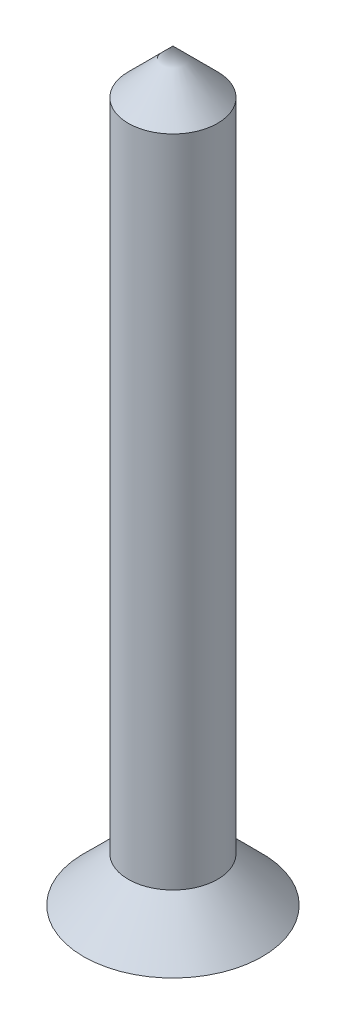
ISO-10303-21;
HEADER;
FILE_DESCRIPTION(('STEP AP214'),'2;1');
FILE_NAME('part.step','',(''),(''),'','','');
FILE_SCHEMA(('AUTOMOTIVE_DESIGN { 1 0 10303 214 1 1 1 1 }'));
ENDSEC;
DATA;
#1=APPLICATION_CONTEXT('core data for automotive mechanical design processes');
#2=APPLICATION_PROTOCOL_DEFINITION('international standard','automotive_design',2000,#1);
#3=PRODUCT_CONTEXT('',#1,'mechanical');
#4=PRODUCT('Part','Part','',(#3));
#5=PRODUCT_RELATED_PRODUCT_CATEGORY('part','',(#4));
#6=PRODUCT_DEFINITION_FORMATION('','',#4);
#7=PRODUCT_DEFINITION_CONTEXT('part definition',#1,'design');
#8=PRODUCT_DEFINITION('design','',#6,#7);
#9=PRODUCT_DEFINITION_SHAPE('','',#8);
#10=(LENGTH_UNIT() NAMED_UNIT(*) SI_UNIT(.MILLI.,.METRE.));
#11=(NAMED_UNIT(*) PLANE_ANGLE_UNIT() SI_UNIT($,.RADIAN.));
#12=(NAMED_UNIT(*) SI_UNIT($,.STERADIAN.) SOLID_ANGLE_UNIT());
#13=UNCERTAINTY_MEASURE_WITH_UNIT(LENGTH_MEASURE(1.E-05),#10,'distance_accuracy_value','');
#14=(GEOMETRIC_REPRESENTATION_CONTEXT(3) GLOBAL_UNCERTAINTY_ASSIGNED_CONTEXT((#13)) GLOBAL_UNIT_ASSIGNED_CONTEXT((#10,
#11,#12)) REPRESENTATION_CONTEXT('',''));
#15=CARTESIAN_POINT('',(0.,0.,0.));
#16=DIRECTION('',(0.,0.,1.));
#17=DIRECTION('',(1.,0.,0.));
#18=AXIS2_PLACEMENT_3D('',#15,#16,#17);
#19=CARTESIAN_POINT('',(0.,0.,0.));
#20=DIRECTION('',(0.,1.,0.));
#21=DIRECTION('',(0.,0.,1.));
#22=AXIS2_PLACEMENT_3D('',#19,#20,#21);
#23=PLANE('',#22);
#24=CARTESIAN_POINT('',(0.,0.,0.));
#25=DIRECTION('',(0.,1.,0.));
#26=DIRECTION('',(0.,0.,1.));
#27=AXIS2_PLACEMENT_3D('',#24,#25,#26);
#28=CIRCLE('',#27,6.);
#29=CARTESIAN_POINT('',(0.,0.,6.));
#30=VERTEX_POINT('',#29);
#31=EDGE_CURVE('E54',#30,#30,#28,.T.);
#32=ORIENTED_EDGE('',*,*,#31,.F.);
#33=EDGE_LOOP('',(#32));
#34=FACE_BOUND('',#33,.T.);
#35=ADVANCED_FACE('F46',(#34),#23,.F.);
#36=CARTESIAN_POINT('',(0.,50.,0.));
#37=DIRECTION('',(0.,-1.,0.));
#38=DIRECTION('',(0.,0.,-1.));
#39=AXIS2_PLACEMENT_3D('',#36,#37,#38);
#40=CYLINDRICAL_SURFACE('',#39,3.);
#41=CARTESIAN_POINT('',(0.,47.,0.));
#42=DIRECTION('',(0.,1.,0.));
#43=DIRECTION('',(0.,0.,1.));
#44=AXIS2_PLACEMENT_3D('',#41,#42,#43);
#45=CIRCLE('',#44,3.);
#46=CARTESIAN_POINT('',(0.,47.,3.));
#47=VERTEX_POINT('',#46);
#48=EDGE_CURVE('E11',#47,#47,#45,.F.);
#49=ORIENTED_EDGE('',*,*,#48,.T.);
#50=EDGE_LOOP('',(#49));
#51=FACE_BOUND('',#50,.T.);
#52=CARTESIAN_POINT('',(0.,3.,0.));
#53=DIRECTION('',(0.,1.,0.));
#54=DIRECTION('',(0.,0.,1.));
#55=AXIS2_PLACEMENT_3D('',#52,#53,#54);
#56=CIRCLE('',#55,3.);
#57=CARTESIAN_POINT('',(0.,3.,3.));
#58=VERTEX_POINT('',#57);
#59=EDGE_CURVE('E78',#58,#58,#56,.T.);
#60=ORIENTED_EDGE('',*,*,#59,.T.);
#61=EDGE_LOOP('',(#60));
#62=FACE_BOUND('',#61,.T.);
#63=ADVANCED_FACE('F58',(#51,#62),#40,.T.);
#64=CARTESIAN_POINT('',(0.,47.,0.));
#65=DIRECTION('',(0.,-1.,0.));
#66=DIRECTION('',(0.,0.,-1.));
#67=AXIS2_PLACEMENT_3D('',#64,#65,#66);
#68=CONICAL_SURFACE('',#67,3.00000000000001,0.785398163397447);
#69=ORIENTED_EDGE('',*,*,#48,.F.);
#70=EDGE_LOOP('',(#69));
#71=FACE_BOUND('',#70,.T.);
#72=CARTESIAN_POINT('',(0.,50.,0.));
#73=VERTEX_POINT('',#72);
#74=VERTEX_LOOP('',#73);
#75=FACE_BOUND('',#74,.T.);
#76=ADVANCED_FACE('F59',(#71,#75),#68,.T.);
#77=CARTESIAN_POINT('',(0.,3.,0.));
#78=DIRECTION('',(0.,-1.,0.));
#79=DIRECTION('',(0.,0.,-1.));
#80=AXIS2_PLACEMENT_3D('',#77,#78,#79);
#81=CONICAL_SURFACE('',#80,3.,0.785398163397446);
#82=ORIENTED_EDGE('',*,*,#31,.T.);
#83=EDGE_LOOP('',(#82));
#84=FACE_BOUND('',#83,.T.);
#85=ORIENTED_EDGE('',*,*,#59,.F.);
#86=EDGE_LOOP('',(#85));
#87=FACE_BOUND('',#86,.T.);
#88=ADVANCED_FACE('F47',(#84,#87),#81,.T.);
#89=CLOSED_SHELL('',(#35,#63,#76,#88));
#90=MANIFOLD_SOLID_BREP('B2',#89);
#91=ADVANCED_BREP_SHAPE_REPRESENTATION('',(#18,#90),#14);
#92=SHAPE_DEFINITION_REPRESENTATION(#9,#91);
ENDSEC;
END-ISO-10303-21;
